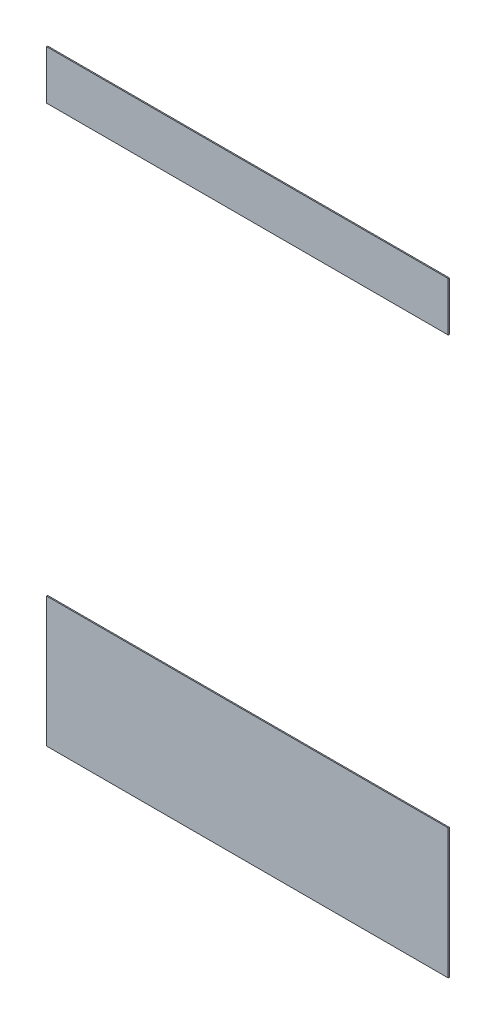
ISO-10303-21;
HEADER;
FILE_DESCRIPTION(('STEP AP214'),'2;1');
FILE_NAME('part.step','',(''),(''),'','','');
FILE_SCHEMA(('AUTOMOTIVE_DESIGN { 1 0 10303 214 1 1 1 1 }'));
ENDSEC;
DATA;
#1=APPLICATION_CONTEXT('core data for automotive mechanical design processes');
#2=APPLICATION_PROTOCOL_DEFINITION('international standard','automotive_design',2000,#1);
#3=PRODUCT_CONTEXT('',#1,'mechanical');
#4=PRODUCT('Part','Part','',(#3));
#5=PRODUCT_RELATED_PRODUCT_CATEGORY('part','',(#4));
#6=PRODUCT_DEFINITION_FORMATION('','',#4);
#7=PRODUCT_DEFINITION_CONTEXT('part definition',#1,'design');
#8=PRODUCT_DEFINITION('design','',#6,#7);
#9=PRODUCT_DEFINITION_SHAPE('','',#8);
#10=(LENGTH_UNIT() NAMED_UNIT(*) SI_UNIT(.MILLI.,.METRE.));
#11=(NAMED_UNIT(*) PLANE_ANGLE_UNIT() SI_UNIT($,.RADIAN.));
#12=(NAMED_UNIT(*) SI_UNIT($,.STERADIAN.) SOLID_ANGLE_UNIT());
#13=UNCERTAINTY_MEASURE_WITH_UNIT(LENGTH_MEASURE(1.E-05),#10,'distance_accuracy_value','');
#14=(GEOMETRIC_REPRESENTATION_CONTEXT(3) GLOBAL_UNCERTAINTY_ASSIGNED_CONTEXT((#13)) GLOBAL_UNIT_ASSIGNED_CONTEXT((#10,
#11,#12)) REPRESENTATION_CONTEXT('',''));
#15=CARTESIAN_POINT('',(0.,0.,0.));
#16=DIRECTION('',(0.,0.,1.));
#17=DIRECTION('',(1.,0.,0.));
#18=AXIS2_PLACEMENT_3D('',#15,#16,#17);
#19=CARTESIAN_POINT('',(5.74540415243519E-12,553.000000035536,-1.));
#20=DIRECTION('',(1.,0.,0.));
#21=DIRECTION('',(0.,0.,-1.));
#22=AXIS2_PLACEMENT_3D('',#19,#20,#21);
#23=PLANE('',#22);
#24=DIRECTION('',(0.,1.,0.));
#25=VECTOR('',#24,1.);
#26=CARTESIAN_POINT('',(5.74540415243519E-12,553.000000035536,0.));
#27=LINE('',#26,#25);
#28=CARTESIAN_POINT('',(5.74540415243519E-12,509.105451912986,0.));
#29=VERTEX_POINT('',#28);
#30=CARTESIAN_POINT('',(5.74540415243519E-12,553.000000035536,0.));
#31=VERTEX_POINT('',#30);
#32=EDGE_CURVE('E12',#29,#31,#27,.T.);
#33=ORIENTED_EDGE('',*,*,#32,.F.);
#34=DIRECTION('',(0.,0.,1.));
#35=VECTOR('',#34,1.);
#36=CARTESIAN_POINT('',(5.74540415243519E-12,509.105451912986,-1.));
#37=LINE('',#36,#35);
#38=CARTESIAN_POINT('',(5.74540415243519E-12,509.105451912986,-1.));
#39=VERTEX_POINT('',#38);
#40=EDGE_CURVE('E94',#39,#29,#37,.T.);
#41=ORIENTED_EDGE('',*,*,#40,.F.);
#42=DIRECTION('',(0.,1.,0.));
#43=VECTOR('',#42,1.);
#44=CARTESIAN_POINT('',(5.74540415243519E-12,553.000000035536,-1.));
#45=LINE('',#44,#43);
#46=CARTESIAN_POINT('',(5.74540415243519E-12,553.000000035536,-1.));
#47=VERTEX_POINT('',#46);
#48=EDGE_CURVE('E51',#39,#47,#45,.T.);
#49=ORIENTED_EDGE('',*,*,#48,.T.);
#50=DIRECTION('',(0.,0.,1.));
#51=VECTOR('',#50,1.);
#52=CARTESIAN_POINT('',(5.74540415243519E-12,553.000000035536,-1.));
#53=LINE('',#52,#51);
#54=EDGE_CURVE('E66',#47,#31,#53,.T.);
#55=ORIENTED_EDGE('',*,*,#54,.T.);
#56=EDGE_LOOP('',(#33,#41,#49,#55));
#57=FACE_BOUND('',#56,.T.);
#58=ADVANCED_FACE('F47',(#57),#23,.T.);
#59=CARTESIAN_POINT('',(5.74540415243519E-12,509.105451912986,-1.));
#60=DIRECTION('',(0.,-1.,0.));
#61=DIRECTION('',(0.,0.,-1.));
#62=AXIS2_PLACEMENT_3D('',#59,#60,#61);
#63=PLANE('',#62);
#64=DIRECTION('',(1.,0.,0.));
#65=VECTOR('',#64,1.);
#66=CARTESIAN_POINT('',(5.74540415243519E-12,509.105451912986,0.));
#67=LINE('',#66,#65);
#68=CARTESIAN_POINT('',(-359.999999999994,509.105451912986,0.));
#69=VERTEX_POINT('',#68);
#70=EDGE_CURVE('E107',#69,#29,#67,.T.);
#71=ORIENTED_EDGE('',*,*,#70,.F.);
#72=DIRECTION('',(0.,0.,1.));
#73=VECTOR('',#72,1.);
#74=CARTESIAN_POINT('',(-359.999999999994,509.105451912986,-1.));
#75=LINE('',#74,#73);
#76=CARTESIAN_POINT('',(-359.999999999994,509.105451912986,-1.));
#77=VERTEX_POINT('',#76);
#78=EDGE_CURVE('E96',#77,#69,#75,.T.);
#79=ORIENTED_EDGE('',*,*,#78,.F.);
#80=DIRECTION('',(1.,0.,0.));
#81=VECTOR('',#80,1.);
#82=CARTESIAN_POINT('',(5.74540415243519E-12,509.105451912986,-1.));
#83=LINE('',#82,#81);
#84=EDGE_CURVE('E115',#77,#39,#83,.T.);
#85=ORIENTED_EDGE('',*,*,#84,.T.);
#86=ORIENTED_EDGE('',*,*,#40,.T.);
#87=EDGE_LOOP('',(#71,#79,#85,#86));
#88=FACE_BOUND('',#87,.T.);
#89=ADVANCED_FACE('F109',(#88),#63,.T.);
#90=CARTESIAN_POINT('',(-359.999999999994,553.000000035536,-1.));
#91=DIRECTION('',(-1.,0.,0.));
#92=DIRECTION('',(0.,0.,1.));
#93=AXIS2_PLACEMENT_3D('',#90,#91,#92);
#94=PLANE('',#93);
#95=DIRECTION('',(0.,-1.,0.));
#96=VECTOR('',#95,1.);
#97=CARTESIAN_POINT('',(-359.999999999994,553.000000035536,0.));
#98=LINE('',#97,#96);
#99=CARTESIAN_POINT('',(-359.999999999994,553.000000035536,0.));
#100=VERTEX_POINT('',#99);
#101=EDGE_CURVE('E99',#100,#69,#98,.T.);
#102=ORIENTED_EDGE('',*,*,#101,.F.);
#103=DIRECTION('',(0.,0.,1.));
#104=VECTOR('',#103,1.);
#105=CARTESIAN_POINT('',(-359.999999999994,553.000000035536,-1.));
#106=LINE('',#105,#104);
#107=CARTESIAN_POINT('',(-359.999999999994,553.000000035536,-1.));
#108=VERTEX_POINT('',#107);
#109=EDGE_CURVE('E83',#108,#100,#106,.T.);
#110=ORIENTED_EDGE('',*,*,#109,.F.);
#111=DIRECTION('',(0.,-1.,0.));
#112=VECTOR('',#111,1.);
#113=CARTESIAN_POINT('',(-359.999999999994,553.000000035536,-1.));
#114=LINE('',#113,#112);
#115=EDGE_CURVE('E101',#108,#77,#114,.T.);
#116=ORIENTED_EDGE('',*,*,#115,.T.);
#117=ORIENTED_EDGE('',*,*,#78,.T.);
#118=EDGE_LOOP('',(#102,#110,#116,#117));
#119=FACE_BOUND('',#118,.T.);
#120=ADVANCED_FACE('F98',(#119),#94,.T.);
#121=CARTESIAN_POINT('',(5.74540415243519E-12,553.000000035536,-1.));
#122=DIRECTION('',(0.,1.,0.));
#123=DIRECTION('',(0.,0.,1.));
#124=AXIS2_PLACEMENT_3D('',#121,#122,#123);
#125=PLANE('',#124);
#126=DIRECTION('',(-1.,0.,0.));
#127=VECTOR('',#126,1.);
#128=CARTESIAN_POINT('',(5.74540415243519E-12,553.000000035536,0.));
#129=LINE('',#128,#127);
#130=EDGE_CURVE('E57',#31,#100,#129,.T.);
#131=ORIENTED_EDGE('',*,*,#130,.F.);
#132=ORIENTED_EDGE('',*,*,#54,.F.);
#133=DIRECTION('',(-1.,0.,0.));
#134=VECTOR('',#133,1.);
#135=CARTESIAN_POINT('',(5.74540415243519E-12,553.000000035536,-1.));
#136=LINE('',#135,#134);
#137=EDGE_CURVE('E111',#47,#108,#136,.T.);
#138=ORIENTED_EDGE('',*,*,#137,.T.);
#139=ORIENTED_EDGE('',*,*,#109,.T.);
#140=EDGE_LOOP('',(#131,#132,#138,#139));
#141=FACE_BOUND('',#140,.T.);
#142=ADVANCED_FACE('F117',(#141),#125,.T.);
#143=CARTESIAN_POINT('',(0.,0.,-1.));
#144=DIRECTION('',(0.,0.,-1.));
#145=DIRECTION('',(-1.,0.,0.));
#146=AXIS2_PLACEMENT_3D('',#143,#144,#145);
#147=PLANE('',#146);
#148=ORIENTED_EDGE('',*,*,#48,.F.);
#149=ORIENTED_EDGE('',*,*,#84,.F.);
#150=ORIENTED_EDGE('',*,*,#115,.F.);
#151=ORIENTED_EDGE('',*,*,#137,.F.);
#152=EDGE_LOOP('',(#148,#149,#150,#151));
#153=FACE_BOUND('',#152,.T.);
#154=ADVANCED_FACE('F49',(#153),#147,.T.);
#155=CARTESIAN_POINT('',(0.,0.,0.));
#156=DIRECTION('',(0.,0.,-1.));
#157=DIRECTION('',(-1.,0.,0.));
#158=AXIS2_PLACEMENT_3D('',#155,#156,#157);
#159=PLANE('',#158);
#160=ORIENTED_EDGE('',*,*,#32,.T.);
#161=ORIENTED_EDGE('',*,*,#130,.T.);
#162=ORIENTED_EDGE('',*,*,#101,.T.);
#163=ORIENTED_EDGE('',*,*,#70,.T.);
#164=EDGE_LOOP('',(#160,#161,#162,#163));
#165=FACE_BOUND('',#164,.T.);
#166=ADVANCED_FACE('F106',(#165),#159,.F.);
#167=CLOSED_SHELL('',(#58,#89,#120,#142,#154,#166));
#168=MANIFOLD_SOLID_BREP('B2',#167);
#169=CARTESIAN_POINT('',(-1.94289029309402E-13,126.500000205687,-1.));
#170=DIRECTION('',(1.,0.,0.));
#171=DIRECTION('',(0.,0.,-1.));
#172=AXIS2_PLACEMENT_3D('',#169,#170,#171);
#173=PLANE('',#172);
#174=DIRECTION('',(0.,1.,0.));
#175=VECTOR('',#174,1.);
#176=CARTESIAN_POINT('',(-1.94289029309402E-13,126.500000205687,0.));
#177=LINE('',#176,#175);
#178=CARTESIAN_POINT('',(-1.94289029309402E-13,9.99999999999645,0.));
#179=VERTEX_POINT('',#178);
#180=CARTESIAN_POINT('',(-1.94289029309402E-13,126.500000205687,0.));
#181=VERTEX_POINT('',#180);
#182=EDGE_CURVE('E247',#179,#181,#177,.T.);
#183=ORIENTED_EDGE('',*,*,#182,.F.);
#184=DIRECTION('',(0.,0.,1.));
#185=VECTOR('',#184,1.);
#186=CARTESIAN_POINT('',(-1.94289029309402E-13,9.99999999999645,-1.));
#187=LINE('',#186,#185);
#188=CARTESIAN_POINT('',(-1.94289029309402E-13,9.99999999999645,-1.));
#189=VERTEX_POINT('',#188);
#190=EDGE_CURVE('E45',#189,#179,#187,.T.);
#191=ORIENTED_EDGE('',*,*,#190,.F.);
#192=DIRECTION('',(0.,1.,0.));
#193=VECTOR('',#192,1.);
#194=CARTESIAN_POINT('',(-1.94289029309402E-13,126.500000205687,-1.));
#195=LINE('',#194,#193);
#196=CARTESIAN_POINT('',(-1.94289029309402E-13,126.500000205687,-1.));
#197=VERTEX_POINT('',#196);
#198=EDGE_CURVE('E241',#189,#197,#195,.T.);
#199=ORIENTED_EDGE('',*,*,#198,.T.);
#200=DIRECTION('',(0.,0.,1.));
#201=VECTOR('',#200,1.);
#202=CARTESIAN_POINT('',(-1.94289029309402E-13,126.500000205687,-1.));
#203=LINE('',#202,#201);
#204=EDGE_CURVE('E186',#197,#181,#203,.T.);
#205=ORIENTED_EDGE('',*,*,#204,.T.);
#206=EDGE_LOOP('',(#183,#191,#199,#205));
#207=FACE_BOUND('',#206,.T.);
#208=ADVANCED_FACE('F183',(#207),#173,.T.);
#209=CARTESIAN_POINT('',(-1.94289029309402E-13,9.99999999999645,-1.));
#210=DIRECTION('',(0.,-1.,0.));
#211=DIRECTION('',(0.,0.,-1.));
#212=AXIS2_PLACEMENT_3D('',#209,#210,#211);
#213=PLANE('',#212);
#214=DIRECTION('',(1.,0.,0.));
#215=VECTOR('',#214,1.);
#216=CARTESIAN_POINT('',(-1.94289029309402E-13,9.99999999999645,0.));
#217=LINE('',#216,#215);
#218=CARTESIAN_POINT('',(-360.,9.99999999999645,0.));
#219=VERTEX_POINT('',#218);
#220=EDGE_CURVE('E243',#219,#179,#217,.T.);
#221=ORIENTED_EDGE('',*,*,#220,.F.);
#222=DIRECTION('',(0.,0.,1.));
#223=VECTOR('',#222,1.);
#224=CARTESIAN_POINT('',(-360.,9.99999999999645,-1.));
#225=LINE('',#224,#223);
#226=CARTESIAN_POINT('',(-360.,9.99999999999645,-1.));
#227=VERTEX_POINT('',#226);
#228=EDGE_CURVE('E192',#227,#219,#225,.T.);
#229=ORIENTED_EDGE('',*,*,#228,.F.);
#230=DIRECTION('',(1.,0.,0.));
#231=VECTOR('',#230,1.);
#232=CARTESIAN_POINT('',(-1.94289029309402E-13,9.99999999999645,-1.));
#233=LINE('',#232,#231);
#234=EDGE_CURVE('E238',#227,#189,#233,.T.);
#235=ORIENTED_EDGE('',*,*,#234,.T.);
#236=ORIENTED_EDGE('',*,*,#190,.T.);
#237=EDGE_LOOP('',(#221,#229,#235,#236));
#238=FACE_BOUND('',#237,.T.);
#239=ADVANCED_FACE('F257',(#238),#213,.T.);
#240=CARTESIAN_POINT('',(-360.,126.500000205687,-1.));
#241=DIRECTION('',(-1.,0.,0.));
#242=DIRECTION('',(0.,0.,1.));
#243=AXIS2_PLACEMENT_3D('',#240,#241,#242);
#244=PLANE('',#243);
#245=DIRECTION('',(0.,-1.,0.));
#246=VECTOR('',#245,1.);
#247=CARTESIAN_POINT('',(-360.,126.500000205687,0.));
#248=LINE('',#247,#246);
#249=CARTESIAN_POINT('',(-360.,126.500000205687,0.));
#250=VERTEX_POINT('',#249);
#251=EDGE_CURVE('E233',#250,#219,#248,.T.);
#252=ORIENTED_EDGE('',*,*,#251,.F.);
#253=DIRECTION('',(0.,0.,1.));
#254=VECTOR('',#253,1.);
#255=CARTESIAN_POINT('',(-360.,126.500000205687,-1.));
#256=LINE('',#255,#254);
#257=CARTESIAN_POINT('',(-360.,126.500000205687,-1.));
#258=VERTEX_POINT('',#257);
#259=EDGE_CURVE('E228',#258,#250,#256,.T.);
#260=ORIENTED_EDGE('',*,*,#259,.F.);
#261=DIRECTION('',(0.,-1.,0.));
#262=VECTOR('',#261,1.);
#263=CARTESIAN_POINT('',(-360.,126.500000205687,-1.));
#264=LINE('',#263,#262);
#265=EDGE_CURVE('E231',#258,#227,#264,.T.);
#266=ORIENTED_EDGE('',*,*,#265,.T.);
#267=ORIENTED_EDGE('',*,*,#228,.T.);
#268=EDGE_LOOP('',(#252,#260,#266,#267));
#269=FACE_BOUND('',#268,.T.);
#270=ADVANCED_FACE('F230',(#269),#244,.T.);
#271=CARTESIAN_POINT('',(-1.94289029309402E-13,126.500000205687,-1.));
#272=DIRECTION('',(0.,1.,0.));
#273=DIRECTION('',(0.,0.,1.));
#274=AXIS2_PLACEMENT_3D('',#271,#272,#273);
#275=PLANE('',#274);
#276=DIRECTION('',(-1.,0.,0.));
#277=VECTOR('',#276,1.);
#278=CARTESIAN_POINT('',(-1.94289029309402E-13,126.500000205687,0.));
#279=LINE('',#278,#277);
#280=EDGE_CURVE('E250',#181,#250,#279,.T.);
#281=ORIENTED_EDGE('',*,*,#280,.F.);
#282=ORIENTED_EDGE('',*,*,#204,.F.);
#283=DIRECTION('',(-1.,0.,0.));
#284=VECTOR('',#283,1.);
#285=CARTESIAN_POINT('',(-1.94289029309402E-13,126.500000205687,-1.));
#286=LINE('',#285,#284);
#287=EDGE_CURVE('E237',#197,#258,#286,.T.);
#288=ORIENTED_EDGE('',*,*,#287,.T.);
#289=ORIENTED_EDGE('',*,*,#259,.T.);
#290=EDGE_LOOP('',(#281,#282,#288,#289));
#291=FACE_BOUND('',#290,.T.);
#292=ADVANCED_FACE('F240',(#291),#275,.T.);
#293=CARTESIAN_POINT('',(0.,0.,-1.));
#294=DIRECTION('',(0.,0.,-1.));
#295=DIRECTION('',(-1.,0.,0.));
#296=AXIS2_PLACEMENT_3D('',#293,#294,#295);
#297=PLANE('',#296);
#298=ORIENTED_EDGE('',*,*,#198,.F.);
#299=ORIENTED_EDGE('',*,*,#234,.F.);
#300=ORIENTED_EDGE('',*,*,#265,.F.);
#301=ORIENTED_EDGE('',*,*,#287,.F.);
#302=EDGE_LOOP('',(#298,#299,#300,#301));
#303=FACE_BOUND('',#302,.T.);
#304=ADVANCED_FACE('F236',(#303),#297,.T.);
#305=CARTESIAN_POINT('',(0.,0.,0.));
#306=DIRECTION('',(0.,0.,-1.));
#307=DIRECTION('',(-1.,0.,0.));
#308=AXIS2_PLACEMENT_3D('',#305,#306,#307);
#309=PLANE('',#308);
#310=ORIENTED_EDGE('',*,*,#182,.T.);
#311=ORIENTED_EDGE('',*,*,#280,.T.);
#312=ORIENTED_EDGE('',*,*,#251,.T.);
#313=ORIENTED_EDGE('',*,*,#220,.T.);
#314=EDGE_LOOP('',(#310,#311,#312,#313));
#315=FACE_BOUND('',#314,.T.);
#316=ADVANCED_FACE('F256',(#315),#309,.F.);
#317=CLOSED_SHELL('',(#208,#239,#270,#292,#304,#316));
#318=MANIFOLD_SOLID_BREP('B6',#317);
#319=ADVANCED_BREP_SHAPE_REPRESENTATION('',(#18,#168,#318),#14);
#320=SHAPE_DEFINITION_REPRESENTATION(#9,#319);
ENDSEC;
END-ISO-10303-21;
